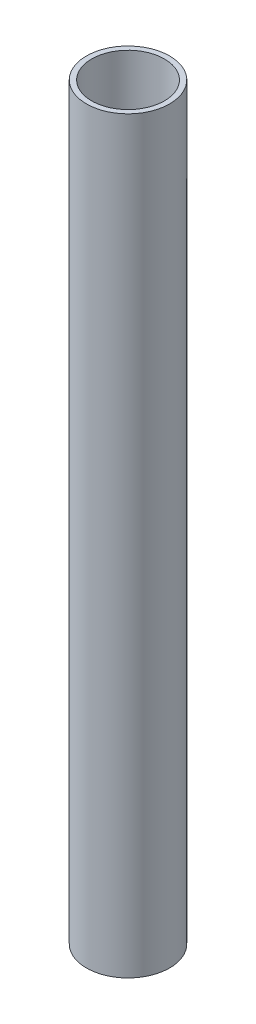
ISO-10303-21;
HEADER;
FILE_DESCRIPTION(('STEP AP214'),'2;1');
FILE_NAME('part.step','',(''),(''),'','','');
FILE_SCHEMA(('AUTOMOTIVE_DESIGN { 1 0 10303 214 1 1 1 1 }'));
ENDSEC;
DATA;
#1=APPLICATION_CONTEXT('core data for automotive mechanical design processes');
#2=APPLICATION_PROTOCOL_DEFINITION('international standard','automotive_design',2000,#1);
#3=PRODUCT_CONTEXT('',#1,'mechanical');
#4=PRODUCT('Part','Part','',(#3));
#5=PRODUCT_RELATED_PRODUCT_CATEGORY('part','',(#4));
#6=PRODUCT_DEFINITION_FORMATION('','',#4);
#7=PRODUCT_DEFINITION_CONTEXT('part definition',#1,'design');
#8=PRODUCT_DEFINITION('design','',#6,#7);
#9=PRODUCT_DEFINITION_SHAPE('','',#8);
#10=(LENGTH_UNIT() NAMED_UNIT(*) SI_UNIT(.MILLI.,.METRE.));
#11=(NAMED_UNIT(*) PLANE_ANGLE_UNIT() SI_UNIT($,.RADIAN.));
#12=(NAMED_UNIT(*) SI_UNIT($,.STERADIAN.) SOLID_ANGLE_UNIT());
#13=UNCERTAINTY_MEASURE_WITH_UNIT(LENGTH_MEASURE(1.E-05),#10,'distance_accuracy_value','');
#14=(GEOMETRIC_REPRESENTATION_CONTEXT(3) GLOBAL_UNCERTAINTY_ASSIGNED_CONTEXT((#13)) GLOBAL_UNIT_ASSIGNED_CONTEXT((#10,
#11,#12)) REPRESENTATION_CONTEXT('',''));
#15=CARTESIAN_POINT('',(0.,0.,0.));
#16=DIRECTION('',(0.,0.,1.));
#17=DIRECTION('',(1.,0.,0.));
#18=AXIS2_PLACEMENT_3D('',#15,#16,#17);
#19=CARTESIAN_POINT('',(0.,457.2,0.));
#20=DIRECTION('',(0.,1.,0.));
#21=DIRECTION('',(0.,0.,1.));
#22=AXIS2_PLACEMENT_3D('',#19,#20,#21);
#23=PLANE('',#22);
#24=CARTESIAN_POINT('',(0.,457.2,0.));
#25=DIRECTION('',(0.,1.,0.));
#26=DIRECTION('',(0.,0.,1.));
#27=AXIS2_PLACEMENT_3D('',#24,#25,#26);
#28=CIRCLE('',#27,25.4);
#29=CARTESIAN_POINT('',(0.,457.2,-25.4));
#30=VERTEX_POINT('',#29);
#31=EDGE_CURVE('E10',#30,#30,#28,.T.);
#32=ORIENTED_EDGE('',*,*,#31,.T.);
#33=EDGE_LOOP('',(#32));
#34=FACE_BOUND('',#33,.T.);
#35=CARTESIAN_POINT('',(0.,457.2,0.));
#36=DIRECTION('',(0.,1.,0.));
#37=DIRECTION('',(0.,0.,1.));
#38=AXIS2_PLACEMENT_3D('',#35,#36,#37);
#39=CIRCLE('',#38,22.225);
#40=CARTESIAN_POINT('',(0.,457.2,-22.225));
#41=VERTEX_POINT('',#40);
#42=EDGE_CURVE('E50',#41,#41,#39,.T.);
#43=ORIENTED_EDGE('',*,*,#42,.F.);
#44=EDGE_LOOP('',(#43));
#45=FACE_BOUND('',#44,.T.);
#46=ADVANCED_FACE('F37',(#34,#45),#23,.T.);
#47=CARTESIAN_POINT('',(0.,0.,0.));
#48=DIRECTION('',(0.,1.,0.));
#49=DIRECTION('',(0.,0.,1.));
#50=AXIS2_PLACEMENT_3D('',#47,#48,#49);
#51=PLANE('',#50);
#52=CARTESIAN_POINT('',(0.,0.,0.));
#53=DIRECTION('',(0.,1.,0.));
#54=DIRECTION('',(0.,0.,1.));
#55=AXIS2_PLACEMENT_3D('',#52,#53,#54);
#56=CIRCLE('',#55,25.4);
#57=CARTESIAN_POINT('',(0.,0.,-25.4));
#58=VERTEX_POINT('',#57);
#59=EDGE_CURVE('E41',#58,#58,#56,.T.);
#60=ORIENTED_EDGE('',*,*,#59,.F.);
#61=EDGE_LOOP('',(#60));
#62=FACE_BOUND('',#61,.T.);
#63=CARTESIAN_POINT('',(0.,0.,0.));
#64=DIRECTION('',(0.,1.,0.));
#65=DIRECTION('',(0.,0.,1.));
#66=AXIS2_PLACEMENT_3D('',#63,#64,#65);
#67=CIRCLE('',#66,22.225);
#68=CARTESIAN_POINT('',(0.,0.,-22.225));
#69=VERTEX_POINT('',#68);
#70=EDGE_CURVE('E52',#69,#69,#67,.T.);
#71=ORIENTED_EDGE('',*,*,#70,.T.);
#72=EDGE_LOOP('',(#71));
#73=FACE_BOUND('',#72,.T.);
#74=ADVANCED_FACE('F64',(#62,#73),#51,.F.);
#75=CARTESIAN_POINT('',(0.,457.2,0.));
#76=DIRECTION('',(0.,-1.,0.));
#77=DIRECTION('',(0.,0.,-1.));
#78=AXIS2_PLACEMENT_3D('',#75,#76,#77);
#79=CYLINDRICAL_SURFACE('',#78,25.4);
#80=CARTESIAN_POINT('',(0.,457.2,-25.4));
#81=CARTESIAN_POINT('',(0.,452.4375,-25.4));
#82=CARTESIAN_POINT('',(0.,447.675,-25.4));
#83=CARTESIAN_POINT('',(0.,438.15,-25.4));
#84=CARTESIAN_POINT('',(0.,433.3875,-25.4));
#85=CARTESIAN_POINT('',(0.,423.8625,-25.4));
#86=CARTESIAN_POINT('',(0.,419.1,-25.4));
#87=CARTESIAN_POINT('',(0.,409.575,-25.4));
#88=CARTESIAN_POINT('',(0.,404.8125,-25.4));
#89=CARTESIAN_POINT('',(0.,395.2875,-25.4));
#90=CARTESIAN_POINT('',(0.,390.525,-25.4));
#91=CARTESIAN_POINT('',(0.,381.,-25.4));
#92=CARTESIAN_POINT('',(0.,376.2375,-25.4));
#93=CARTESIAN_POINT('',(0.,366.7125,-25.4));
#94=CARTESIAN_POINT('',(0.,361.95,-25.4));
#95=CARTESIAN_POINT('',(0.,352.425,-25.4));
#96=CARTESIAN_POINT('',(0.,347.6625,-25.4));
#97=CARTESIAN_POINT('',(0.,338.1375,-25.4));
#98=CARTESIAN_POINT('',(0.,333.375,-25.4));
#99=CARTESIAN_POINT('',(0.,323.85,-25.4));
#100=CARTESIAN_POINT('',(0.,319.0875,-25.4));
#101=CARTESIAN_POINT('',(0.,309.5625,-25.4));
#102=CARTESIAN_POINT('',(0.,304.8,-25.4));
#103=CARTESIAN_POINT('',(0.,295.275,-25.4));
#104=CARTESIAN_POINT('',(0.,290.5125,-25.4));
#105=CARTESIAN_POINT('',(0.,280.9875,-25.4));
#106=CARTESIAN_POINT('',(0.,276.225,-25.4));
#107=CARTESIAN_POINT('',(0.,266.7,-25.4));
#108=CARTESIAN_POINT('',(0.,261.9375,-25.4));
#109=CARTESIAN_POINT('',(0.,252.4125,-25.4));
#110=CARTESIAN_POINT('',(0.,247.65,-25.4));
#111=CARTESIAN_POINT('',(0.,238.125,-25.4));
#112=CARTESIAN_POINT('',(0.,233.3625,-25.4));
#113=CARTESIAN_POINT('',(0.,223.8375,-25.4));
#114=CARTESIAN_POINT('',(0.,219.075,-25.4));
#115=CARTESIAN_POINT('',(0.,209.55,-25.4));
#116=CARTESIAN_POINT('',(0.,204.7875,-25.4));
#117=CARTESIAN_POINT('',(0.,195.2625,-25.4));
#118=CARTESIAN_POINT('',(0.,190.5,-25.4));
#119=CARTESIAN_POINT('',(0.,180.975,-25.4));
#120=CARTESIAN_POINT('',(0.,176.2125,-25.4));
#121=CARTESIAN_POINT('',(0.,166.6875,-25.4));
#122=CARTESIAN_POINT('',(0.,161.925,-25.4));
#123=CARTESIAN_POINT('',(0.,152.4,-25.4));
#124=CARTESIAN_POINT('',(0.,147.6375,-25.4));
#125=CARTESIAN_POINT('',(0.,138.1125,-25.4));
#126=CARTESIAN_POINT('',(0.,133.35,-25.4));
#127=CARTESIAN_POINT('',(0.,123.825,-25.4));
#128=CARTESIAN_POINT('',(0.,119.0625,-25.4));
#129=CARTESIAN_POINT('',(0.,109.5375,-25.4));
#130=CARTESIAN_POINT('',(0.,104.775,-25.4));
#131=CARTESIAN_POINT('',(0.,95.25,-25.4));
#132=CARTESIAN_POINT('',(0.,90.4875,-25.4));
#133=CARTESIAN_POINT('',(0.,80.9625,-25.4));
#134=CARTESIAN_POINT('',(0.,76.2,-25.4));
#135=CARTESIAN_POINT('',(0.,66.675,-25.4));
#136=CARTESIAN_POINT('',(0.,61.9125,-25.4));
#137=CARTESIAN_POINT('',(0.,52.3875,-25.4));
#138=CARTESIAN_POINT('',(0.,47.625,-25.4));
#139=CARTESIAN_POINT('',(0.,38.1,-25.4));
#140=CARTESIAN_POINT('',(0.,33.3375,-25.4));
#141=CARTESIAN_POINT('',(0.,23.8125,-25.4));
#142=CARTESIAN_POINT('',(0.,19.05,-25.4));
#143=CARTESIAN_POINT('',(0.,9.52499999999995,-25.4));
#144=CARTESIAN_POINT('',(0.,4.76249999999994,-25.4));
#145=CARTESIAN_POINT('',(0.,0.,-25.4));
#146=B_SPLINE_CURVE_WITH_KNOTS('',3,(#80,#81,#82,#83,#84,#85,#86,#87,#88,#89,#90,#91,#92,#93,
#94,#95,#96,#97,#98,#99,#100,#101,#102,#103,#104,#105,#106,#107,#108,#109,#110,#111,#112,#113,
#114,#115,#116,#117,#118,#119,#120,#121,#122,#123,#124,#125,#126,#127,#128,#129,#130,#131,#132,
#133,#134,#135,#136,#137,#138,#139,#140,#141,#142,#143,#144,#145),.UNSPECIFIED.,.F.,.F.,(4,2,2,
2,2,2,2,2,2,2,2,2,2,2,2,2,2,2,2,2,2,2,2,2,2,2,2,2,2,2,2,2,4),(0.,14.2875,28.575,42.8625,57.15,
71.4375,85.7250000000001,100.0125,114.3,128.5875,142.875,157.1625,171.45,185.7375,200.025,
214.3125,228.6,242.8875,257.175,271.4625,285.75,300.0375,314.325,328.6125,342.9,357.1875,
371.475,385.7625,400.05,414.3375,428.625,442.9125,457.2),.UNSPECIFIED.);
#147=EDGE_CURVE('BSEAM39',#30,#58,#146,.T.);
#148=ORIENTED_EDGE('',*,*,#31,.F.);
#149=ORIENTED_EDGE('',*,*,#59,.T.);
#150=ORIENTED_EDGE('',*,*,#147,.T.);
#151=ORIENTED_EDGE('',*,*,#147,.F.);
#152=EDGE_LOOP('',(#148,#150,#149,#151));
#153=FACE_BOUND('',#152,.T.);
#154=ADVANCED_FACE('F39',(#153),#79,.T.);
#155=CARTESIAN_POINT('',(0.,457.2,0.));
#156=DIRECTION('',(0.,-1.,0.));
#157=DIRECTION('',(0.,0.,-1.));
#158=AXIS2_PLACEMENT_3D('',#155,#156,#157);
#159=CYLINDRICAL_SURFACE('',#158,22.225);
#160=CARTESIAN_POINT('',(0.,457.2,-22.225));
#161=CARTESIAN_POINT('',(0.,452.4375,-22.225));
#162=CARTESIAN_POINT('',(0.,447.675,-22.225));
#163=CARTESIAN_POINT('',(0.,438.15,-22.225));
#164=CARTESIAN_POINT('',(0.,433.3875,-22.225));
#165=CARTESIAN_POINT('',(0.,423.8625,-22.225));
#166=CARTESIAN_POINT('',(0.,419.1,-22.225));
#167=CARTESIAN_POINT('',(0.,409.575,-22.225));
#168=CARTESIAN_POINT('',(0.,404.8125,-22.225));
#169=CARTESIAN_POINT('',(0.,395.2875,-22.225));
#170=CARTESIAN_POINT('',(0.,390.525,-22.225));
#171=CARTESIAN_POINT('',(0.,381.,-22.225));
#172=CARTESIAN_POINT('',(0.,376.2375,-22.225));
#173=CARTESIAN_POINT('',(0.,366.7125,-22.225));
#174=CARTESIAN_POINT('',(0.,361.95,-22.225));
#175=CARTESIAN_POINT('',(0.,352.425,-22.225));
#176=CARTESIAN_POINT('',(0.,347.6625,-22.225));
#177=CARTESIAN_POINT('',(0.,338.1375,-22.225));
#178=CARTESIAN_POINT('',(0.,333.375,-22.225));
#179=CARTESIAN_POINT('',(0.,323.85,-22.225));
#180=CARTESIAN_POINT('',(0.,319.0875,-22.225));
#181=CARTESIAN_POINT('',(0.,309.5625,-22.225));
#182=CARTESIAN_POINT('',(0.,304.8,-22.225));
#183=CARTESIAN_POINT('',(0.,295.275,-22.225));
#184=CARTESIAN_POINT('',(0.,290.5125,-22.225));
#185=CARTESIAN_POINT('',(0.,280.9875,-22.225));
#186=CARTESIAN_POINT('',(0.,276.225,-22.225));
#187=CARTESIAN_POINT('',(0.,266.7,-22.225));
#188=CARTESIAN_POINT('',(0.,261.9375,-22.225));
#189=CARTESIAN_POINT('',(0.,252.4125,-22.225));
#190=CARTESIAN_POINT('',(0.,247.65,-22.225));
#191=CARTESIAN_POINT('',(0.,238.125,-22.225));
#192=CARTESIAN_POINT('',(0.,233.3625,-22.225));
#193=CARTESIAN_POINT('',(0.,223.8375,-22.225));
#194=CARTESIAN_POINT('',(0.,219.075,-22.225));
#195=CARTESIAN_POINT('',(0.,209.55,-22.225));
#196=CARTESIAN_POINT('',(0.,204.7875,-22.225));
#197=CARTESIAN_POINT('',(0.,195.2625,-22.225));
#198=CARTESIAN_POINT('',(0.,190.5,-22.225));
#199=CARTESIAN_POINT('',(0.,180.975,-22.225));
#200=CARTESIAN_POINT('',(0.,176.2125,-22.225));
#201=CARTESIAN_POINT('',(0.,166.6875,-22.225));
#202=CARTESIAN_POINT('',(0.,161.925,-22.225));
#203=CARTESIAN_POINT('',(0.,152.4,-22.225));
#204=CARTESIAN_POINT('',(0.,147.6375,-22.225));
#205=CARTESIAN_POINT('',(0.,138.1125,-22.225));
#206=CARTESIAN_POINT('',(0.,133.35,-22.225));
#207=CARTESIAN_POINT('',(0.,123.825,-22.225));
#208=CARTESIAN_POINT('',(0.,119.0625,-22.225));
#209=CARTESIAN_POINT('',(0.,109.5375,-22.225));
#210=CARTESIAN_POINT('',(0.,104.775,-22.225));
#211=CARTESIAN_POINT('',(0.,95.2499999999999,-22.225));
#212=CARTESIAN_POINT('',(0.,90.4874999999999,-22.225));
#213=CARTESIAN_POINT('',(0.,80.9624999999999,-22.225));
#214=CARTESIAN_POINT('',(0.,76.2,-22.225));
#215=CARTESIAN_POINT('',(0.,66.675,-22.225));
#216=CARTESIAN_POINT('',(0.,61.9125,-22.225));
#217=CARTESIAN_POINT('',(0.,52.3875,-22.225));
#218=CARTESIAN_POINT('',(0.,47.625,-22.225));
#219=CARTESIAN_POINT('',(0.,38.1,-22.225));
#220=CARTESIAN_POINT('',(0.,33.3375,-22.225));
#221=CARTESIAN_POINT('',(0.,23.8125,-22.225));
#222=CARTESIAN_POINT('',(0.,19.05,-22.225));
#223=CARTESIAN_POINT('',(0.,9.52499999999995,-22.225));
#224=CARTESIAN_POINT('',(0.,4.76249999999994,-22.225));
#225=CARTESIAN_POINT('',(0.,0.,-22.225));
#226=B_SPLINE_CURVE_WITH_KNOTS('',3,(#160,#161,#162,#163,#164,#165,#166,#167,#168,#169,#170,
#171,#172,#173,#174,#175,#176,#177,#178,#179,#180,#181,#182,#183,#184,#185,#186,#187,#188,#189,
#190,#191,#192,#193,#194,#195,#196,#197,#198,#199,#200,#201,#202,#203,#204,#205,#206,#207,#208,
#209,#210,#211,#212,#213,#214,#215,#216,#217,#218,#219,#220,#221,#222,#223,#224,#225),
.UNSPECIFIED.,.F.,.F.,(4,2,2,2,2,2,2,2,2,2,2,2,2,2,2,2,2,2,2,2,2,2,2,2,2,2,2,2,2,2,2,2,4),(0.,
14.2875,28.575,42.8625,57.15,71.4375,85.725,100.0125,114.3,128.5875,142.875,157.1625,171.45,
185.7375,200.025,214.3125,228.6,242.8875,257.175,271.4625,285.75,300.0375,314.325,328.6125,
342.9,357.1875,371.475,385.7625,400.05,414.3375,428.625,442.9125,457.2),.UNSPECIFIED.);
#227=EDGE_CURVE('BSEAM60',#41,#69,#226,.T.);
#228=ORIENTED_EDGE('',*,*,#42,.T.);
#229=ORIENTED_EDGE('',*,*,#70,.F.);
#230=ORIENTED_EDGE('',*,*,#227,.T.);
#231=ORIENTED_EDGE('',*,*,#227,.F.);
#232=EDGE_LOOP('',(#228,#230,#229,#231));
#233=FACE_BOUND('',#232,.T.);
#234=ADVANCED_FACE('F60',(#233),#159,.F.);
#235=CLOSED_SHELL('',(#46,#74,#154,#234));
#236=MANIFOLD_SOLID_BREP('B2',#235);
#237=ADVANCED_BREP_SHAPE_REPRESENTATION('',(#18,#236),#14);
#238=SHAPE_DEFINITION_REPRESENTATION(#9,#237);
ENDSEC;
END-ISO-10303-21;
